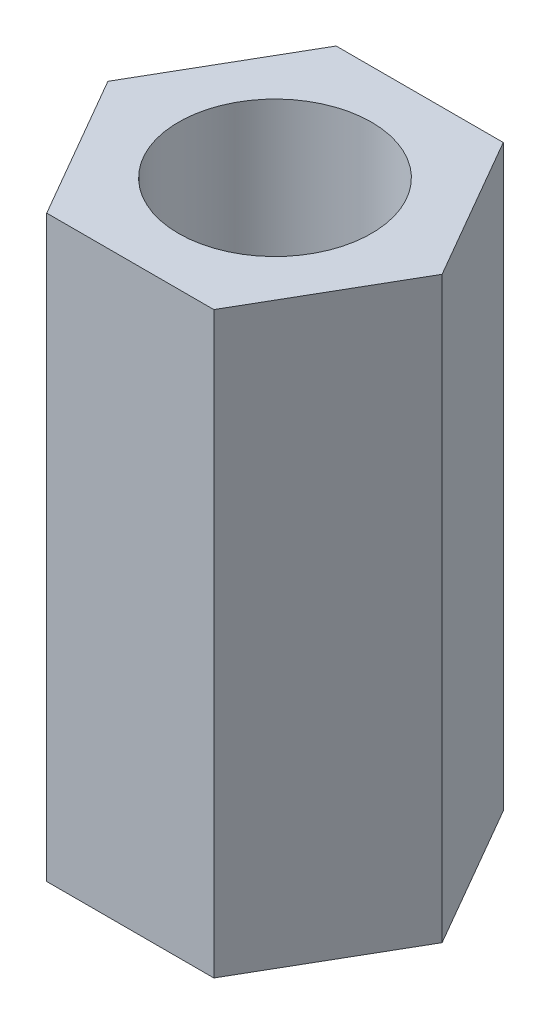
ISO-10303-21;
HEADER;
FILE_DESCRIPTION(('STEP AP214'),'2;1');
FILE_NAME('part.step','',(''),(''),'','','');
FILE_SCHEMA(('AUTOMOTIVE_DESIGN { 1 0 10303 214 1 1 1 1 }'));
ENDSEC;
DATA;
#1=APPLICATION_CONTEXT('core data for automotive mechanical design processes');
#2=APPLICATION_PROTOCOL_DEFINITION('international standard','automotive_design',2000,#1);
#3=PRODUCT_CONTEXT('',#1,'mechanical');
#4=PRODUCT('Part','Part','',(#3));
#5=PRODUCT_RELATED_PRODUCT_CATEGORY('part','',(#4));
#6=PRODUCT_DEFINITION_FORMATION('','',#4);
#7=PRODUCT_DEFINITION_CONTEXT('part definition',#1,'design');
#8=PRODUCT_DEFINITION('design','',#6,#7);
#9=PRODUCT_DEFINITION_SHAPE('','',#8);
#10=(LENGTH_UNIT() NAMED_UNIT(*) SI_UNIT(.MILLI.,.METRE.));
#11=(NAMED_UNIT(*) PLANE_ANGLE_UNIT() SI_UNIT($,.RADIAN.));
#12=(NAMED_UNIT(*) SI_UNIT($,.STERADIAN.) SOLID_ANGLE_UNIT());
#13=UNCERTAINTY_MEASURE_WITH_UNIT(LENGTH_MEASURE(1.E-05),#10,'distance_accuracy_value','');
#14=(GEOMETRIC_REPRESENTATION_CONTEXT(3) GLOBAL_UNCERTAINTY_ASSIGNED_CONTEXT((#13)) GLOBAL_UNIT_ASSIGNED_CONTEXT((#10,
#11,#12)) REPRESENTATION_CONTEXT('',''));
#15=CARTESIAN_POINT('',(0.,0.,0.));
#16=DIRECTION('',(0.,0.,1.));
#17=DIRECTION('',(1.,0.,0.));
#18=AXIS2_PLACEMENT_3D('',#15,#16,#17);
#19=CARTESIAN_POINT('',(0.866025403784457,6.,1.49999999999999));
#20=DIRECTION('',(-0.866025403784441,0.,-0.499999999999995));
#21=DIRECTION('',(-0.499999999999995,0.,0.866025403784442));
#22=AXIS2_PLACEMENT_3D('',#19,#20,#21);
#23=PLANE('',#22);
#24=DIRECTION('',(0.499999999999995,0.,-0.866025403784442));
#25=VECTOR('',#24,1.);
#26=CARTESIAN_POINT('',(0.866025403784457,0.,1.49999999999999));
#27=LINE('',#26,#25);
#28=CARTESIAN_POINT('',(0.866025403784457,0.,1.49999999999999));
#29=VERTEX_POINT('',#28);
#30=CARTESIAN_POINT('',(1.73205080756888,0.,0.));
#31=VERTEX_POINT('',#30);
#32=EDGE_CURVE('E123',#29,#31,#27,.T.);
#33=ORIENTED_EDGE('',*,*,#32,.T.);
#34=DIRECTION('',(0.,-1.,0.));
#35=VECTOR('',#34,1.);
#36=CARTESIAN_POINT('',(1.73205080756888,6.,0.));
#37=LINE('',#36,#35);
#38=CARTESIAN_POINT('',(1.73205080756888,6.,0.));
#39=VERTEX_POINT('',#38);
#40=EDGE_CURVE('E11',#39,#31,#37,.T.);
#41=ORIENTED_EDGE('',*,*,#40,.F.);
#42=DIRECTION('',(0.499999999999995,0.,-0.866025403784442));
#43=VECTOR('',#42,1.);
#44=CARTESIAN_POINT('',(0.866025403784457,6.,1.49999999999999));
#45=LINE('',#44,#43);
#46=CARTESIAN_POINT('',(0.866025403784457,6.,1.49999999999999));
#47=VERTEX_POINT('',#46);
#48=EDGE_CURVE('E134',#47,#39,#45,.T.);
#49=ORIENTED_EDGE('',*,*,#48,.F.);
#50=DIRECTION('',(0.,-1.,0.));
#51=VECTOR('',#50,1.);
#52=CARTESIAN_POINT('',(0.866025403784457,6.,1.49999999999999));
#53=LINE('',#52,#51);
#54=EDGE_CURVE('E119',#47,#29,#53,.T.);
#55=ORIENTED_EDGE('',*,*,#54,.T.);
#56=EDGE_LOOP('',(#33,#41,#49,#55));
#57=FACE_BOUND('',#56,.T.);
#58=ADVANCED_FACE('F39',(#57),#23,.F.);
#59=CARTESIAN_POINT('',(1.73205080756888,6.,0.));
#60=DIRECTION('',(-0.866025403784438,0.,0.500000000000001));
#61=DIRECTION('',(0.500000000000001,0.,0.866025403784438));
#62=AXIS2_PLACEMENT_3D('',#59,#60,#61);
#63=PLANE('',#62);
#64=DIRECTION('',(-0.500000000000001,0.,-0.866025403784438));
#65=VECTOR('',#64,1.);
#66=CARTESIAN_POINT('',(1.73205080756888,0.,0.));
#67=LINE('',#66,#65);
#68=CARTESIAN_POINT('',(0.866025403784436,0.,-1.5));
#69=VERTEX_POINT('',#68);
#70=EDGE_CURVE('E126',#31,#69,#67,.T.);
#71=ORIENTED_EDGE('',*,*,#70,.T.);
#72=DIRECTION('',(0.,-1.,0.));
#73=VECTOR('',#72,1.);
#74=CARTESIAN_POINT('',(0.866025403784436,6.,-1.5));
#75=LINE('',#74,#73);
#76=CARTESIAN_POINT('',(0.866025403784436,6.,-1.5));
#77=VERTEX_POINT('',#76);
#78=EDGE_CURVE('E47',#77,#69,#75,.T.);
#79=ORIENTED_EDGE('',*,*,#78,.F.);
#80=DIRECTION('',(-0.500000000000001,0.,-0.866025403784438));
#81=VECTOR('',#80,1.);
#82=CARTESIAN_POINT('',(1.73205080756888,6.,0.));
#83=LINE('',#82,#81);
#84=EDGE_CURVE('E92',#39,#77,#83,.T.);
#85=ORIENTED_EDGE('',*,*,#84,.F.);
#86=ORIENTED_EDGE('',*,*,#40,.T.);
#87=EDGE_LOOP('',(#71,#79,#85,#86));
#88=FACE_BOUND('',#87,.T.);
#89=ADVANCED_FACE('F159',(#88),#63,.F.);
#90=CARTESIAN_POINT('',(0.866025403784436,6.,-1.5));
#91=DIRECTION('',(0.,0.,1.));
#92=DIRECTION('',(1.,0.,0.));
#93=AXIS2_PLACEMENT_3D('',#90,#91,#92);
#94=PLANE('',#93);
#95=DIRECTION('',(-1.,0.,0.));
#96=VECTOR('',#95,1.);
#97=CARTESIAN_POINT('',(0.866025403784436,0.,-1.5));
#98=LINE('',#97,#96);
#99=CARTESIAN_POINT('',(-0.866025403784446,0.,-1.5));
#100=VERTEX_POINT('',#99);
#101=EDGE_CURVE('E129',#69,#100,#98,.T.);
#102=ORIENTED_EDGE('',*,*,#101,.T.);
#103=DIRECTION('',(0.,-1.,0.));
#104=VECTOR('',#103,1.);
#105=CARTESIAN_POINT('',(-0.866025403784446,6.,-1.5));
#106=LINE('',#105,#104);
#107=CARTESIAN_POINT('',(-0.866025403784446,6.,-1.5));
#108=VERTEX_POINT('',#107);
#109=EDGE_CURVE('E114',#108,#100,#106,.T.);
#110=ORIENTED_EDGE('',*,*,#109,.F.);
#111=DIRECTION('',(-1.,0.,0.));
#112=VECTOR('',#111,1.);
#113=CARTESIAN_POINT('',(0.866025403784436,6.,-1.5));
#114=LINE('',#113,#112);
#115=EDGE_CURVE('E105',#77,#108,#114,.T.);
#116=ORIENTED_EDGE('',*,*,#115,.F.);
#117=ORIENTED_EDGE('',*,*,#78,.T.);
#118=EDGE_LOOP('',(#102,#110,#116,#117));
#119=FACE_BOUND('',#118,.T.);
#120=ADVANCED_FACE('F140',(#119),#94,.F.);
#121=CARTESIAN_POINT('',(-0.866025403784446,6.,-1.5));
#122=DIRECTION('',(0.866025403784441,0.,0.499999999999995));
#123=DIRECTION('',(0.499999999999995,0.,-0.866025403784442));
#124=AXIS2_PLACEMENT_3D('',#121,#122,#123);
#125=PLANE('',#124);
#126=DIRECTION('',(-0.499999999999995,0.,0.866025403784442));
#127=VECTOR('',#126,1.);
#128=CARTESIAN_POINT('',(-0.866025403784446,0.,-1.5));
#129=LINE('',#128,#127);
#130=CARTESIAN_POINT('',(-1.73205080756888,0.,0.));
#131=VERTEX_POINT('',#130);
#132=EDGE_CURVE('E113',#100,#131,#129,.T.);
#133=ORIENTED_EDGE('',*,*,#132,.T.);
#134=DIRECTION('',(0.,-1.,0.));
#135=VECTOR('',#134,1.);
#136=CARTESIAN_POINT('',(-1.73205080756888,6.,0.));
#137=LINE('',#136,#135);
#138=CARTESIAN_POINT('',(-1.73205080756888,6.,0.));
#139=VERTEX_POINT('',#138);
#140=EDGE_CURVE('E110',#139,#131,#137,.T.);
#141=ORIENTED_EDGE('',*,*,#140,.F.);
#142=DIRECTION('',(-0.499999999999995,0.,0.866025403784442));
#143=VECTOR('',#142,1.);
#144=CARTESIAN_POINT('',(-0.866025403784446,6.,-1.5));
#145=LINE('',#144,#143);
#146=EDGE_CURVE('E99',#108,#139,#145,.T.);
#147=ORIENTED_EDGE('',*,*,#146,.F.);
#148=ORIENTED_EDGE('',*,*,#109,.T.);
#149=EDGE_LOOP('',(#133,#141,#147,#148));
#150=FACE_BOUND('',#149,.T.);
#151=ADVANCED_FACE('F111',(#150),#125,.F.);
#152=CARTESIAN_POINT('',(-1.73205080756888,6.,0.));
#153=DIRECTION('',(0.866025403784435,0.,-0.500000000000007));
#154=DIRECTION('',(-0.500000000000007,0.,-0.866025403784434));
#155=AXIS2_PLACEMENT_3D('',#152,#153,#154);
#156=PLANE('',#155);
#157=DIRECTION('',(0.500000000000007,0.,0.866025403784434));
#158=VECTOR('',#157,1.);
#159=CARTESIAN_POINT('',(-1.73205080756888,0.,0.));
#160=LINE('',#159,#158);
#161=CARTESIAN_POINT('',(-0.866025403784425,0.,1.50000000000001));
#162=VERTEX_POINT('',#161);
#163=EDGE_CURVE('E78',#131,#162,#160,.T.);
#164=ORIENTED_EDGE('',*,*,#163,.T.);
#165=DIRECTION('',(0.,-1.,0.));
#166=VECTOR('',#165,1.);
#167=CARTESIAN_POINT('',(-0.866025403784425,6.,1.50000000000001));
#168=LINE('',#167,#166);
#169=CARTESIAN_POINT('',(-0.866025403784425,6.,1.50000000000001));
#170=VERTEX_POINT('',#169);
#171=EDGE_CURVE('E115',#170,#162,#168,.T.);
#172=ORIENTED_EDGE('',*,*,#171,.F.);
#173=DIRECTION('',(0.500000000000007,0.,0.866025403784434));
#174=VECTOR('',#173,1.);
#175=CARTESIAN_POINT('',(-1.73205080756888,6.,0.));
#176=LINE('',#175,#174);
#177=EDGE_CURVE('E103',#139,#170,#176,.T.);
#178=ORIENTED_EDGE('',*,*,#177,.F.);
#179=ORIENTED_EDGE('',*,*,#140,.T.);
#180=EDGE_LOOP('',(#164,#172,#178,#179));
#181=FACE_BOUND('',#180,.T.);
#182=ADVANCED_FACE('F117',(#181),#156,.F.);
#183=CARTESIAN_POINT('',(-0.866025403784425,6.,1.50000000000001));
#184=DIRECTION('',(0.,0.,-1.));
#185=DIRECTION('',(-1.,0.,0.));
#186=AXIS2_PLACEMENT_3D('',#183,#184,#185);
#187=PLANE('',#186);
#188=DIRECTION('',(1.,0.,0.));
#189=VECTOR('',#188,1.);
#190=CARTESIAN_POINT('',(-0.866025403784425,0.,1.50000000000001));
#191=LINE('',#190,#189);
#192=EDGE_CURVE('E84',#162,#29,#191,.T.);
#193=ORIENTED_EDGE('',*,*,#192,.T.);
#194=ORIENTED_EDGE('',*,*,#54,.F.);
#195=DIRECTION('',(1.,0.,0.));
#196=VECTOR('',#195,1.);
#197=CARTESIAN_POINT('',(-0.866025403784425,6.,1.50000000000001));
#198=LINE('',#197,#196);
#199=EDGE_CURVE('E55',#170,#47,#198,.T.);
#200=ORIENTED_EDGE('',*,*,#199,.F.);
#201=ORIENTED_EDGE('',*,*,#171,.T.);
#202=EDGE_LOOP('',(#193,#194,#200,#201));
#203=FACE_BOUND('',#202,.T.);
#204=ADVANCED_FACE('F147',(#203),#187,.F.);
#205=CARTESIAN_POINT('',(0.,6.,0.));
#206=DIRECTION('',(0.,1.,0.));
#207=DIRECTION('',(0.,0.,1.));
#208=AXIS2_PLACEMENT_3D('',#205,#206,#207);
#209=PLANE('',#208);
#210=CARTESIAN_POINT('',(0.,6.,0.));
#211=DIRECTION('',(0.,1.,0.));
#212=DIRECTION('',(0.,0.,1.));
#213=AXIS2_PLACEMENT_3D('',#210,#211,#212);
#214=CIRCLE('',#213,1.);
#215=CARTESIAN_POINT('',(0.,6.,1.));
#216=VERTEX_POINT('',#215);
#217=EDGE_CURVE('E215',#216,#216,#214,.T.);
#218=ORIENTED_EDGE('',*,*,#217,.F.);
#219=EDGE_LOOP('',(#218));
#220=FACE_BOUND('',#219,.T.);
#221=ORIENTED_EDGE('',*,*,#48,.T.);
#222=ORIENTED_EDGE('',*,*,#84,.T.);
#223=ORIENTED_EDGE('',*,*,#115,.T.);
#224=ORIENTED_EDGE('',*,*,#146,.T.);
#225=ORIENTED_EDGE('',*,*,#177,.T.);
#226=ORIENTED_EDGE('',*,*,#199,.T.);
#227=EDGE_LOOP('',(#221,#222,#223,#224,#225,#226));
#228=FACE_BOUND('',#227,.T.);
#229=ADVANCED_FACE('F101',(#220,#228),#209,.T.);
#230=CARTESIAN_POINT('',(0.,0.,0.));
#231=DIRECTION('',(0.,1.,0.));
#232=DIRECTION('',(0.,0.,1.));
#233=AXIS2_PLACEMENT_3D('',#230,#231,#232);
#234=PLANE('',#233);
#235=CARTESIAN_POINT('',(0.,0.,0.));
#236=DIRECTION('',(0.,1.,0.));
#237=DIRECTION('',(0.,0.,1.));
#238=AXIS2_PLACEMENT_3D('',#235,#236,#237);
#239=CIRCLE('',#238,1.);
#240=CARTESIAN_POINT('',(0.,0.,1.));
#241=VERTEX_POINT('',#240);
#242=EDGE_CURVE('E127',#241,#241,#239,.T.);
#243=ORIENTED_EDGE('',*,*,#242,.T.);
#244=EDGE_LOOP('',(#243));
#245=FACE_BOUND('',#244,.T.);
#246=ORIENTED_EDGE('',*,*,#32,.F.);
#247=ORIENTED_EDGE('',*,*,#192,.F.);
#248=ORIENTED_EDGE('',*,*,#163,.F.);
#249=ORIENTED_EDGE('',*,*,#132,.F.);
#250=ORIENTED_EDGE('',*,*,#101,.F.);
#251=ORIENTED_EDGE('',*,*,#70,.F.);
#252=EDGE_LOOP('',(#246,#247,#248,#249,#250,#251));
#253=FACE_BOUND('',#252,.T.);
#254=ADVANCED_FACE('F143',(#245,#253),#234,.F.);
#255=CARTESIAN_POINT('',(0.,0.,0.));
#256=DIRECTION('',(0.,1.,0.));
#257=DIRECTION('',(0.,0.,1.));
#258=AXIS2_PLACEMENT_3D('',#255,#256,#257);
#259=CYLINDRICAL_SURFACE('',#258,1.);
#260=ORIENTED_EDGE('',*,*,#242,.F.);
#261=EDGE_LOOP('',(#260));
#262=FACE_BOUND('',#261,.T.);
#263=ORIENTED_EDGE('',*,*,#217,.T.);
#264=EDGE_LOOP('',(#263));
#265=FACE_BOUND('',#264,.T.);
#266=ADVANCED_FACE('F198',(#262,#265),#259,.F.);
#267=CLOSED_SHELL('',(#58,#89,#120,#151,#182,#204,#229,#254,#266));
#268=MANIFOLD_SOLID_BREP('B2',#267);
#269=ADVANCED_BREP_SHAPE_REPRESENTATION('',(#18,#268),#14);
#270=SHAPE_DEFINITION_REPRESENTATION(#9,#269);
ENDSEC;
END-ISO-10303-21;
